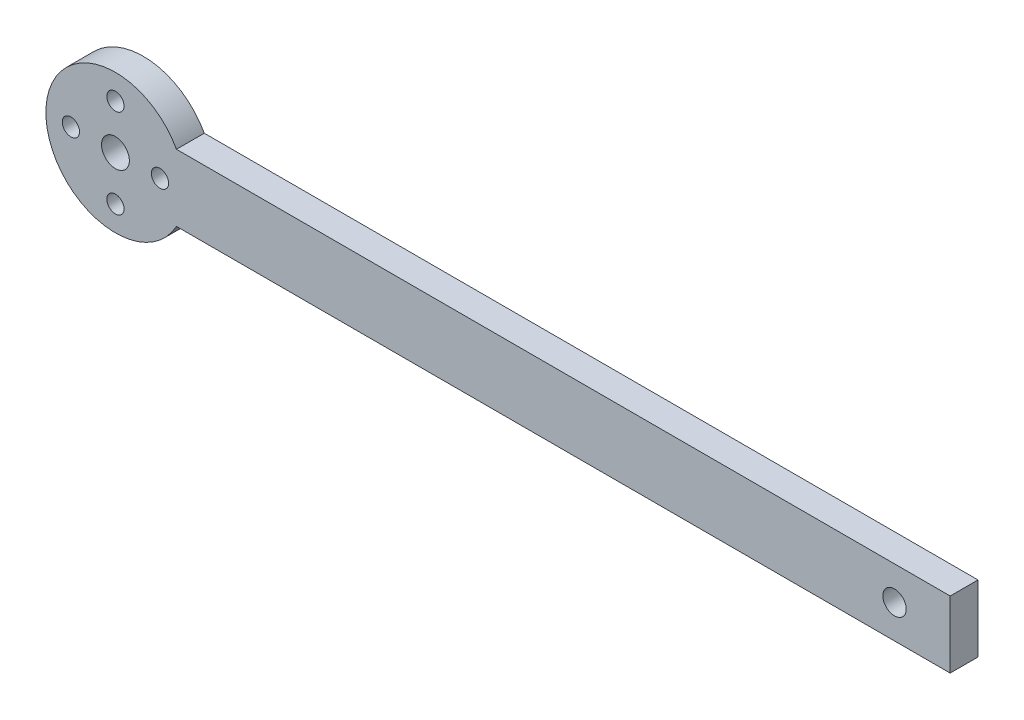
ISO-10303-21;
HEADER;
FILE_DESCRIPTION(('STEP AP214'),'2;1');
FILE_NAME('part.step','',(''),(''),'','','');
FILE_SCHEMA(('AUTOMOTIVE_DESIGN { 1 0 10303 214 1 1 1 1 }'));
ENDSEC;
DATA;
#1=APPLICATION_CONTEXT('core data for automotive mechanical design processes');
#2=APPLICATION_PROTOCOL_DEFINITION('international standard','automotive_design',2000,#1);
#3=PRODUCT_CONTEXT('',#1,'mechanical');
#4=PRODUCT('Part','Part','',(#3));
#5=PRODUCT_RELATED_PRODUCT_CATEGORY('part','',(#4));
#6=PRODUCT_DEFINITION_FORMATION('','',#4);
#7=PRODUCT_DEFINITION_CONTEXT('part definition',#1,'design');
#8=PRODUCT_DEFINITION('design','',#6,#7);
#9=PRODUCT_DEFINITION_SHAPE('','',#8);
#10=(LENGTH_UNIT() NAMED_UNIT(*) SI_UNIT(.MILLI.,.METRE.));
#11=(NAMED_UNIT(*) PLANE_ANGLE_UNIT() SI_UNIT($,.RADIAN.));
#12=(NAMED_UNIT(*) SI_UNIT($,.STERADIAN.) SOLID_ANGLE_UNIT());
#13=UNCERTAINTY_MEASURE_WITH_UNIT(LENGTH_MEASURE(1.E-05),#10,'distance_accuracy_value','');
#14=(GEOMETRIC_REPRESENTATION_CONTEXT(3) GLOBAL_UNCERTAINTY_ASSIGNED_CONTEXT((#13)) GLOBAL_UNIT_ASSIGNED_CONTEXT((#10,
#11,#12)) REPRESENTATION_CONTEXT('',''));
#15=CARTESIAN_POINT('',(0.,0.,0.));
#16=DIRECTION('',(0.,0.,1.));
#17=DIRECTION('',(1.,0.,0.));
#18=AXIS2_PLACEMENT_3D('',#15,#16,#17);
#19=CARTESIAN_POINT('',(0.,0.,5.));
#20=DIRECTION('',(0.,0.,-1.));
#21=DIRECTION('',(-1.,0.,0.));
#22=AXIS2_PLACEMENT_3D('',#19,#20,#21);
#23=CYLINDRICAL_SURFACE('',#22,12.5);
#24=CARTESIAN_POINT('',(0.,0.,0.));
#25=DIRECTION('',(0.,0.,1.));
#26=DIRECTION('',(1.,0.,0.));
#27=AXIS2_PLACEMENT_3D('',#24,#25,#26);
#28=CIRCLE('',#27,12.5);
#29=CARTESIAN_POINT('',(10.9658560997307,6.,0.));
#30=VERTEX_POINT('',#29);
#31=CARTESIAN_POINT('',(10.9658560997307,-6.,0.));
#32=VERTEX_POINT('',#31);
#33=EDGE_CURVE('E113',#30,#32,#28,.T.);
#34=ORIENTED_EDGE('',*,*,#33,.T.);
#35=DIRECTION('',(0.,0.,-1.));
#36=VECTOR('',#35,1.);
#37=CARTESIAN_POINT('',(10.9658560997307,-6.,5.));
#38=LINE('',#37,#36);
#39=CARTESIAN_POINT('',(10.9658560997307,-6.,5.));
#40=VERTEX_POINT('',#39);
#41=EDGE_CURVE('E11',#40,#32,#38,.T.);
#42=ORIENTED_EDGE('',*,*,#41,.F.);
#43=CARTESIAN_POINT('',(0.,0.,5.));
#44=DIRECTION('',(0.,0.,1.));
#45=DIRECTION('',(1.,0.,0.));
#46=AXIS2_PLACEMENT_3D('',#43,#44,#45);
#47=CIRCLE('',#46,12.5);
#48=CARTESIAN_POINT('',(10.9658560997307,6.,5.));
#49=VERTEX_POINT('',#48);
#50=EDGE_CURVE('E97',#49,#40,#47,.T.);
#51=ORIENTED_EDGE('',*,*,#50,.F.);
#52=DIRECTION('',(0.,0.,-1.));
#53=VECTOR('',#52,1.);
#54=CARTESIAN_POINT('',(10.9658560997307,6.,5.));
#55=LINE('',#54,#53);
#56=EDGE_CURVE('E109',#49,#30,#55,.T.);
#57=ORIENTED_EDGE('',*,*,#56,.T.);
#58=EDGE_LOOP('',(#34,#42,#51,#57));
#59=FACE_BOUND('',#58,.T.);
#60=ADVANCED_FACE('F45',(#59),#23,.T.);
#61=CARTESIAN_POINT('',(150.,-6.,5.));
#62=DIRECTION('',(0.,1.,0.));
#63=DIRECTION('',(0.,0.,1.));
#64=AXIS2_PLACEMENT_3D('',#61,#62,#63);
#65=PLANE('',#64);
#66=DIRECTION('',(1.,0.,0.));
#67=VECTOR('',#66,1.);
#68=CARTESIAN_POINT('',(150.,-6.,0.));
#69=LINE('',#68,#67);
#70=CARTESIAN_POINT('',(150.,-6.,0.));
#71=VERTEX_POINT('',#70);
#72=EDGE_CURVE('E102',#32,#71,#69,.T.);
#73=ORIENTED_EDGE('',*,*,#72,.T.);
#74=DIRECTION('',(0.,0.,-1.));
#75=VECTOR('',#74,1.);
#76=CARTESIAN_POINT('',(150.,-6.,5.));
#77=LINE('',#76,#75);
#78=CARTESIAN_POINT('',(150.,-6.,5.));
#79=VERTEX_POINT('',#78);
#80=EDGE_CURVE('E54',#79,#71,#77,.T.);
#81=ORIENTED_EDGE('',*,*,#80,.F.);
#82=DIRECTION('',(1.,0.,0.));
#83=VECTOR('',#82,1.);
#84=CARTESIAN_POINT('',(150.,-6.,5.));
#85=LINE('',#84,#83);
#86=EDGE_CURVE('E92',#40,#79,#85,.T.);
#87=ORIENTED_EDGE('',*,*,#86,.F.);
#88=ORIENTED_EDGE('',*,*,#41,.T.);
#89=EDGE_LOOP('',(#73,#81,#87,#88));
#90=FACE_BOUND('',#89,.T.);
#91=ADVANCED_FACE('F101',(#90),#65,.F.);
#92=CARTESIAN_POINT('',(150.,6.,5.));
#93=DIRECTION('',(-1.,0.,0.));
#94=DIRECTION('',(0.,0.,1.));
#95=AXIS2_PLACEMENT_3D('',#92,#93,#94);
#96=PLANE('',#95);
#97=DIRECTION('',(0.,1.,0.));
#98=VECTOR('',#97,1.);
#99=CARTESIAN_POINT('',(150.,6.,0.));
#100=LINE('',#99,#98);
#101=CARTESIAN_POINT('',(150.,6.,0.));
#102=VERTEX_POINT('',#101);
#103=EDGE_CURVE('E79',#71,#102,#100,.T.);
#104=ORIENTED_EDGE('',*,*,#103,.T.);
#105=DIRECTION('',(0.,0.,-1.));
#106=VECTOR('',#105,1.);
#107=CARTESIAN_POINT('',(150.,6.,5.));
#108=LINE('',#107,#106);
#109=CARTESIAN_POINT('',(150.,6.,5.));
#110=VERTEX_POINT('',#109);
#111=EDGE_CURVE('E104',#110,#102,#108,.T.);
#112=ORIENTED_EDGE('',*,*,#111,.F.);
#113=DIRECTION('',(0.,1.,0.));
#114=VECTOR('',#113,1.);
#115=CARTESIAN_POINT('',(150.,6.,5.));
#116=LINE('',#115,#114);
#117=EDGE_CURVE('E95',#79,#110,#116,.T.);
#118=ORIENTED_EDGE('',*,*,#117,.F.);
#119=ORIENTED_EDGE('',*,*,#80,.T.);
#120=EDGE_LOOP('',(#104,#112,#118,#119));
#121=FACE_BOUND('',#120,.T.);
#122=ADVANCED_FACE('F105',(#121),#96,.F.);
#123=CARTESIAN_POINT('',(10.9658560997307,6.,5.));
#124=DIRECTION('',(0.,-1.,0.));
#125=DIRECTION('',(0.,0.,-1.));
#126=AXIS2_PLACEMENT_3D('',#123,#124,#125);
#127=PLANE('',#126);
#128=DIRECTION('',(-1.,0.,0.));
#129=VECTOR('',#128,1.);
#130=CARTESIAN_POINT('',(10.9658560997307,6.,0.));
#131=LINE('',#130,#129);
#132=EDGE_CURVE('E85',#102,#30,#131,.T.);
#133=ORIENTED_EDGE('',*,*,#132,.T.);
#134=ORIENTED_EDGE('',*,*,#56,.F.);
#135=DIRECTION('',(-1.,0.,0.));
#136=VECTOR('',#135,1.);
#137=CARTESIAN_POINT('',(10.9658560997307,6.,5.));
#138=LINE('',#137,#136);
#139=EDGE_CURVE('E62',#110,#49,#138,.T.);
#140=ORIENTED_EDGE('',*,*,#139,.F.);
#141=ORIENTED_EDGE('',*,*,#111,.T.);
#142=EDGE_LOOP('',(#133,#134,#140,#141));
#143=FACE_BOUND('',#142,.T.);
#144=ADVANCED_FACE('F127',(#143),#127,.F.);
#145=CARTESIAN_POINT('',(0.,0.,5.));
#146=DIRECTION('',(0.,0.,1.));
#147=DIRECTION('',(1.,0.,0.));
#148=AXIS2_PLACEMENT_3D('',#145,#146,#147);
#149=PLANE('',#148);
#150=CARTESIAN_POINT('',(140.,0.,5.));
#151=DIRECTION('',(0.,0.,1.));
#152=DIRECTION('',(1.,0.,0.));
#153=AXIS2_PLACEMENT_3D('',#150,#151,#152);
#154=CIRCLE('',#153,2.09999999999999);
#155=CARTESIAN_POINT('',(142.1,0.,5.));
#156=VERTEX_POINT('',#155);
#157=EDGE_CURVE('E160',#156,#156,#154,.T.);
#158=ORIENTED_EDGE('',*,*,#157,.F.);
#159=EDGE_LOOP('',(#158));
#160=FACE_BOUND('',#159,.T.);
#161=CARTESIAN_POINT('',(0.,-8.,5.));
#162=DIRECTION('',(0.,0.,1.));
#163=DIRECTION('',(1.,0.,0.));
#164=AXIS2_PLACEMENT_3D('',#161,#162,#163);
#165=CIRCLE('',#164,1.55);
#166=CARTESIAN_POINT('',(1.55,-8.,5.));
#167=VERTEX_POINT('',#166);
#168=EDGE_CURVE('E164',#167,#167,#165,.T.);
#169=ORIENTED_EDGE('',*,*,#168,.F.);
#170=EDGE_LOOP('',(#169));
#171=FACE_BOUND('',#170,.T.);
#172=CARTESIAN_POINT('',(8.,0.,5.));
#173=DIRECTION('',(0.,0.,1.));
#174=DIRECTION('',(1.,0.,0.));
#175=AXIS2_PLACEMENT_3D('',#172,#173,#174);
#176=CIRCLE('',#175,1.55);
#177=CARTESIAN_POINT('',(9.55,0.,5.));
#178=VERTEX_POINT('',#177);
#179=EDGE_CURVE('E148',#178,#178,#176,.T.);
#180=ORIENTED_EDGE('',*,*,#179,.F.);
#181=EDGE_LOOP('',(#180));
#182=FACE_BOUND('',#181,.T.);
#183=CARTESIAN_POINT('',(0.,8.,5.));
#184=DIRECTION('',(0.,0.,1.));
#185=DIRECTION('',(1.,0.,0.));
#186=AXIS2_PLACEMENT_3D('',#183,#184,#185);
#187=CIRCLE('',#186,1.55);
#188=CARTESIAN_POINT('',(1.55,8.,5.));
#189=VERTEX_POINT('',#188);
#190=EDGE_CURVE('E147',#189,#189,#187,.T.);
#191=ORIENTED_EDGE('',*,*,#190,.F.);
#192=EDGE_LOOP('',(#191));
#193=FACE_BOUND('',#192,.T.);
#194=CARTESIAN_POINT('',(0.,0.,5.));
#195=DIRECTION('',(0.,0.,1.));
#196=DIRECTION('',(1.,0.,0.));
#197=AXIS2_PLACEMENT_3D('',#194,#195,#196);
#198=CIRCLE('',#197,2.5);
#199=CARTESIAN_POINT('',(2.5,0.,5.));
#200=VERTEX_POINT('',#199);
#201=EDGE_CURVE('E156',#200,#200,#198,.T.);
#202=ORIENTED_EDGE('',*,*,#201,.F.);
#203=EDGE_LOOP('',(#202));
#204=FACE_BOUND('',#203,.T.);
#205=CARTESIAN_POINT('',(-8.,0.,5.));
#206=DIRECTION('',(0.,0.,1.));
#207=DIRECTION('',(1.,0.,0.));
#208=AXIS2_PLACEMENT_3D('',#205,#206,#207);
#209=CIRCLE('',#208,1.55);
#210=CARTESIAN_POINT('',(-6.45,0.,5.));
#211=VERTEX_POINT('',#210);
#212=EDGE_CURVE('E138',#211,#211,#209,.T.);
#213=ORIENTED_EDGE('',*,*,#212,.F.);
#214=EDGE_LOOP('',(#213));
#215=FACE_BOUND('',#214,.T.);
#216=ORIENTED_EDGE('',*,*,#50,.T.);
#217=ORIENTED_EDGE('',*,*,#86,.T.);
#218=ORIENTED_EDGE('',*,*,#117,.T.);
#219=ORIENTED_EDGE('',*,*,#139,.T.);
#220=EDGE_LOOP('',(#216,#217,#218,#219));
#221=FACE_BOUND('',#220,.T.);
#222=ADVANCED_FACE('F93',(#160,#171,#182,#193,#204,#215,#221),#149,.T.);
#223=CARTESIAN_POINT('',(0.,0.,0.));
#224=DIRECTION('',(0.,0.,1.));
#225=DIRECTION('',(1.,0.,0.));
#226=AXIS2_PLACEMENT_3D('',#223,#224,#225);
#227=PLANE('',#226);
#228=CARTESIAN_POINT('',(140.,0.,0.));
#229=DIRECTION('',(0.,0.,1.));
#230=DIRECTION('',(1.,0.,0.));
#231=AXIS2_PLACEMENT_3D('',#228,#229,#230);
#232=CIRCLE('',#231,2.09999999999999);
#233=CARTESIAN_POINT('',(142.1,0.,0.));
#234=VERTEX_POINT('',#233);
#235=EDGE_CURVE('E117',#234,#234,#232,.T.);
#236=ORIENTED_EDGE('',*,*,#235,.T.);
#237=EDGE_LOOP('',(#236));
#238=FACE_BOUND('',#237,.T.);
#239=CARTESIAN_POINT('',(0.,-8.,0.));
#240=DIRECTION('',(0.,0.,1.));
#241=DIRECTION('',(1.,0.,0.));
#242=AXIS2_PLACEMENT_3D('',#239,#240,#241);
#243=CIRCLE('',#242,1.55);
#244=CARTESIAN_POINT('',(1.55,-8.,0.));
#245=VERTEX_POINT('',#244);
#246=EDGE_CURVE('E142',#245,#245,#243,.T.);
#247=ORIENTED_EDGE('',*,*,#246,.T.);
#248=EDGE_LOOP('',(#247));
#249=FACE_BOUND('',#248,.T.);
#250=CARTESIAN_POINT('',(8.,0.,0.));
#251=DIRECTION('',(0.,0.,1.));
#252=DIRECTION('',(1.,0.,0.));
#253=AXIS2_PLACEMENT_3D('',#250,#251,#252);
#254=CIRCLE('',#253,1.55);
#255=CARTESIAN_POINT('',(9.55,0.,0.));
#256=VERTEX_POINT('',#255);
#257=EDGE_CURVE('E168',#256,#256,#254,.T.);
#258=ORIENTED_EDGE('',*,*,#257,.T.);
#259=EDGE_LOOP('',(#258));
#260=FACE_BOUND('',#259,.T.);
#261=CARTESIAN_POINT('',(0.,8.,0.));
#262=DIRECTION('',(0.,0.,1.));
#263=DIRECTION('',(1.,0.,0.));
#264=AXIS2_PLACEMENT_3D('',#261,#262,#263);
#265=CIRCLE('',#264,1.55);
#266=CARTESIAN_POINT('',(1.55,8.,0.));
#267=VERTEX_POINT('',#266);
#268=EDGE_CURVE('E143',#267,#267,#265,.T.);
#269=ORIENTED_EDGE('',*,*,#268,.T.);
#270=EDGE_LOOP('',(#269));
#271=FACE_BOUND('',#270,.T.);
#272=CARTESIAN_POINT('',(0.,0.,0.));
#273=DIRECTION('',(0.,0.,1.));
#274=DIRECTION('',(1.,0.,0.));
#275=AXIS2_PLACEMENT_3D('',#272,#273,#274);
#276=CIRCLE('',#275,2.5);
#277=CARTESIAN_POINT('',(2.5,0.,0.));
#278=VERTEX_POINT('',#277);
#279=EDGE_CURVE('E152',#278,#278,#276,.T.);
#280=ORIENTED_EDGE('',*,*,#279,.T.);
#281=EDGE_LOOP('',(#280));
#282=FACE_BOUND('',#281,.T.);
#283=CARTESIAN_POINT('',(-8.,0.,0.));
#284=DIRECTION('',(0.,0.,1.));
#285=DIRECTION('',(1.,0.,0.));
#286=AXIS2_PLACEMENT_3D('',#283,#284,#285);
#287=CIRCLE('',#286,1.55);
#288=CARTESIAN_POINT('',(-6.45,0.,0.));
#289=VERTEX_POINT('',#288);
#290=EDGE_CURVE('E134',#289,#289,#287,.T.);
#291=ORIENTED_EDGE('',*,*,#290,.T.);
#292=EDGE_LOOP('',(#291));
#293=FACE_BOUND('',#292,.T.);
#294=ORIENTED_EDGE('',*,*,#33,.F.);
#295=ORIENTED_EDGE('',*,*,#132,.F.);
#296=ORIENTED_EDGE('',*,*,#103,.F.);
#297=ORIENTED_EDGE('',*,*,#72,.F.);
#298=EDGE_LOOP('',(#294,#295,#296,#297));
#299=FACE_BOUND('',#298,.T.);
#300=ADVANCED_FACE('F130',(#238,#249,#260,#271,#282,#293,#299),#227,.F.);
#301=CARTESIAN_POINT('',(-8.,0.,0.));
#302=DIRECTION('',(0.,0.,1.));
#303=DIRECTION('',(1.,0.,0.));
#304=AXIS2_PLACEMENT_3D('',#301,#302,#303);
#305=CYLINDRICAL_SURFACE('',#304,1.55);
#306=ORIENTED_EDGE('',*,*,#290,.F.);
#307=EDGE_LOOP('',(#306));
#308=FACE_BOUND('',#307,.T.);
#309=ORIENTED_EDGE('',*,*,#212,.T.);
#310=EDGE_LOOP('',(#309));
#311=FACE_BOUND('',#310,.T.);
#312=ADVANCED_FACE('F204',(#308,#311),#305,.F.);
#313=CARTESIAN_POINT('',(0.,0.,0.));
#314=DIRECTION('',(0.,0.,1.));
#315=DIRECTION('',(1.,0.,0.));
#316=AXIS2_PLACEMENT_3D('',#313,#314,#315);
#317=CYLINDRICAL_SURFACE('',#316,2.5);
#318=ORIENTED_EDGE('',*,*,#279,.F.);
#319=EDGE_LOOP('',(#318));
#320=FACE_BOUND('',#319,.T.);
#321=ORIENTED_EDGE('',*,*,#201,.T.);
#322=EDGE_LOOP('',(#321));
#323=FACE_BOUND('',#322,.T.);
#324=ADVANCED_FACE('F206',(#320,#323),#317,.F.);
#325=CARTESIAN_POINT('',(0.,8.,0.));
#326=DIRECTION('',(0.,0.,1.));
#327=DIRECTION('',(1.,0.,0.));
#328=AXIS2_PLACEMENT_3D('',#325,#326,#327);
#329=CYLINDRICAL_SURFACE('',#328,1.55);
#330=ORIENTED_EDGE('',*,*,#268,.F.);
#331=EDGE_LOOP('',(#330));
#332=FACE_BOUND('',#331,.T.);
#333=ORIENTED_EDGE('',*,*,#190,.T.);
#334=EDGE_LOOP('',(#333));
#335=FACE_BOUND('',#334,.T.);
#336=ADVANCED_FACE('F213',(#332,#335),#329,.F.);
#337=CARTESIAN_POINT('',(8.,0.,0.));
#338=DIRECTION('',(0.,0.,1.));
#339=DIRECTION('',(1.,0.,0.));
#340=AXIS2_PLACEMENT_3D('',#337,#338,#339);
#341=CYLINDRICAL_SURFACE('',#340,1.55);
#342=ORIENTED_EDGE('',*,*,#257,.F.);
#343=EDGE_LOOP('',(#342));
#344=FACE_BOUND('',#343,.T.);
#345=ORIENTED_EDGE('',*,*,#179,.T.);
#346=EDGE_LOOP('',(#345));
#347=FACE_BOUND('',#346,.T.);
#348=ADVANCED_FACE('F263',(#344,#347),#341,.F.);
#349=CARTESIAN_POINT('',(0.,-8.,0.));
#350=DIRECTION('',(0.,0.,1.));
#351=DIRECTION('',(1.,0.,0.));
#352=AXIS2_PLACEMENT_3D('',#349,#350,#351);
#353=CYLINDRICAL_SURFACE('',#352,1.55);
#354=ORIENTED_EDGE('',*,*,#246,.F.);
#355=EDGE_LOOP('',(#354));
#356=FACE_BOUND('',#355,.T.);
#357=ORIENTED_EDGE('',*,*,#168,.T.);
#358=EDGE_LOOP('',(#357));
#359=FACE_BOUND('',#358,.T.);
#360=ADVANCED_FACE('F187',(#356,#359),#353,.F.);
#361=CARTESIAN_POINT('',(140.,0.,0.));
#362=DIRECTION('',(0.,0.,1.));
#363=DIRECTION('',(1.,0.,0.));
#364=AXIS2_PLACEMENT_3D('',#361,#362,#363);
#365=CYLINDRICAL_SURFACE('',#364,2.09999999999999);
#366=ORIENTED_EDGE('',*,*,#235,.F.);
#367=EDGE_LOOP('',(#366));
#368=FACE_BOUND('',#367,.T.);
#369=ORIENTED_EDGE('',*,*,#157,.T.);
#370=EDGE_LOOP('',(#369));
#371=FACE_BOUND('',#370,.T.);
#372=ADVANCED_FACE('F184',(#368,#371),#365,.F.);
#373=CLOSED_SHELL('',(#60,#91,#122,#144,#222,#300,#312,#324,#336,#348,#360,#372));
#374=MANIFOLD_SOLID_BREP('B2',#373);
#375=ADVANCED_BREP_SHAPE_REPRESENTATION('',(#18,#374),#14);
#376=SHAPE_DEFINITION_REPRESENTATION(#9,#375);
ENDSEC;
END-ISO-10303-21;
